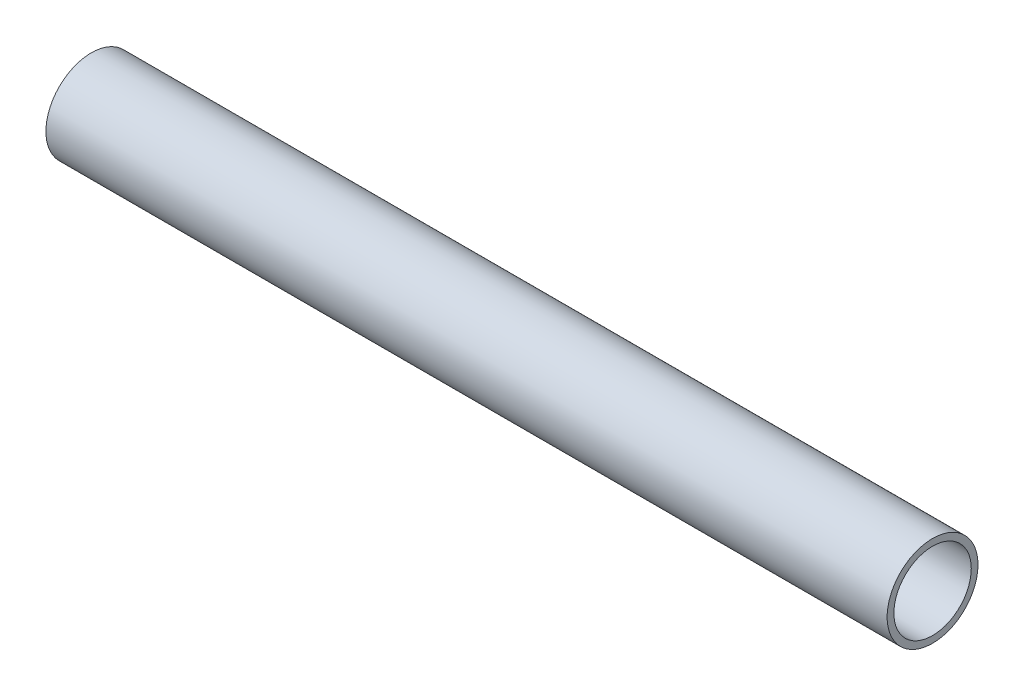
ISO-10303-21;
HEADER;
FILE_DESCRIPTION(('STEP AP214'),'2;1');
FILE_NAME('part.step','',(''),(''),'','','');
FILE_SCHEMA(('AUTOMOTIVE_DESIGN { 1 0 10303 214 1 1 1 1 }'));
ENDSEC;
DATA;
#1=APPLICATION_CONTEXT('core data for automotive mechanical design processes');
#2=APPLICATION_PROTOCOL_DEFINITION('international standard','automotive_design',2000,#1);
#3=PRODUCT_CONTEXT('',#1,'mechanical');
#4=PRODUCT('Part','Part','',(#3));
#5=PRODUCT_RELATED_PRODUCT_CATEGORY('part','',(#4));
#6=PRODUCT_DEFINITION_FORMATION('','',#4);
#7=PRODUCT_DEFINITION_CONTEXT('part definition',#1,'design');
#8=PRODUCT_DEFINITION('design','',#6,#7);
#9=PRODUCT_DEFINITION_SHAPE('','',#8);
#10=(LENGTH_UNIT() NAMED_UNIT(*) SI_UNIT(.MILLI.,.METRE.));
#11=(NAMED_UNIT(*) PLANE_ANGLE_UNIT() SI_UNIT($,.RADIAN.));
#12=(NAMED_UNIT(*) SI_UNIT($,.STERADIAN.) SOLID_ANGLE_UNIT());
#13=UNCERTAINTY_MEASURE_WITH_UNIT(LENGTH_MEASURE(1.E-05),#10,'distance_accuracy_value','');
#14=(GEOMETRIC_REPRESENTATION_CONTEXT(3) GLOBAL_UNCERTAINTY_ASSIGNED_CONTEXT((#13)) GLOBAL_UNIT_ASSIGNED_CONTEXT((#10,
#11,#12)) REPRESENTATION_CONTEXT('',''));
#15=CARTESIAN_POINT('',(0.,0.,0.));
#16=DIRECTION('',(0.,0.,1.));
#17=DIRECTION('',(1.,0.,0.));
#18=AXIS2_PLACEMENT_3D('',#15,#16,#17);
#19=CARTESIAN_POINT('',(200.,300.,-250.));
#20=DIRECTION('',(1.,0.,0.));
#21=DIRECTION('',(0.,0.,-1.));
#22=AXIS2_PLACEMENT_3D('',#19,#20,#21);
#23=CYLINDRICAL_SURFACE('',#22,13.5);
#24=CARTESIAN_POINT('',(200.,300.,-250.));
#25=DIRECTION('',(1.,0.,0.));
#26=DIRECTION('',(0.,0.,-1.));
#27=AXIS2_PLACEMENT_3D('',#24,#25,#26);
#28=CIRCLE('',#27,13.5);
#29=CARTESIAN_POINT('',(200.,300.,-263.5));
#30=VERTEX_POINT('',#29);
#31=EDGE_CURVE('E10',#30,#30,#28,.T.);
#32=CARTESIAN_POINT('',(450.,300.,-250.));
#33=DIRECTION('',(1.,0.,0.));
#34=DIRECTION('',(0.,0.,-1.));
#35=AXIS2_PLACEMENT_3D('',#32,#33,#34);
#36=CIRCLE('',#35,13.5);
#37=CARTESIAN_POINT('',(450.,300.,-263.5));
#38=VERTEX_POINT('',#37);
#39=EDGE_CURVE('E47',#38,#38,#36,.T.);
#40=CARTESIAN_POINT('',(200.,300.,-263.5));
#41=CARTESIAN_POINT('',(202.604166666667,300.,-263.5));
#42=CARTESIAN_POINT('',(205.208333333333,300.,-263.5));
#43=CARTESIAN_POINT('',(210.416666666667,300.,-263.5));
#44=CARTESIAN_POINT('',(213.020833333333,300.,-263.5));
#45=CARTESIAN_POINT('',(218.229166666667,300.,-263.5));
#46=CARTESIAN_POINT('',(220.833333333333,300.,-263.5));
#47=CARTESIAN_POINT('',(226.041666666667,300.,-263.5));
#48=CARTESIAN_POINT('',(228.645833333333,300.,-263.5));
#49=CARTESIAN_POINT('',(233.854166666667,300.,-263.5));
#50=CARTESIAN_POINT('',(236.458333333333,300.,-263.5));
#51=CARTESIAN_POINT('',(241.666666666667,300.,-263.5));
#52=CARTESIAN_POINT('',(244.270833333333,300.,-263.5));
#53=CARTESIAN_POINT('',(249.479166666667,300.,-263.5));
#54=CARTESIAN_POINT('',(252.083333333333,300.,-263.5));
#55=CARTESIAN_POINT('',(257.291666666667,300.,-263.5));
#56=CARTESIAN_POINT('',(259.895833333333,300.,-263.5));
#57=CARTESIAN_POINT('',(265.104166666667,300.,-263.5));
#58=CARTESIAN_POINT('',(267.708333333333,300.,-263.5));
#59=CARTESIAN_POINT('',(272.916666666667,300.,-263.5));
#60=CARTESIAN_POINT('',(275.520833333333,300.,-263.5));
#61=CARTESIAN_POINT('',(280.729166666667,300.,-263.5));
#62=CARTESIAN_POINT('',(283.333333333333,300.,-263.5));
#63=CARTESIAN_POINT('',(288.541666666667,300.,-263.5));
#64=CARTESIAN_POINT('',(291.145833333333,300.,-263.5));
#65=CARTESIAN_POINT('',(296.354166666667,300.,-263.5));
#66=CARTESIAN_POINT('',(298.958333333333,300.,-263.5));
#67=CARTESIAN_POINT('',(304.166666666667,300.,-263.5));
#68=CARTESIAN_POINT('',(306.770833333333,300.,-263.5));
#69=CARTESIAN_POINT('',(311.979166666667,300.,-263.5));
#70=CARTESIAN_POINT('',(314.583333333333,300.,-263.5));
#71=CARTESIAN_POINT('',(319.791666666667,300.,-263.5));
#72=CARTESIAN_POINT('',(322.395833333333,300.,-263.5));
#73=CARTESIAN_POINT('',(327.604166666667,300.,-263.5));
#74=CARTESIAN_POINT('',(330.208333333333,300.,-263.5));
#75=CARTESIAN_POINT('',(335.416666666667,300.,-263.5));
#76=CARTESIAN_POINT('',(338.020833333333,300.,-263.5));
#77=CARTESIAN_POINT('',(343.229166666667,300.,-263.5));
#78=CARTESIAN_POINT('',(345.833333333333,300.,-263.5));
#79=CARTESIAN_POINT('',(351.041666666667,300.,-263.5));
#80=CARTESIAN_POINT('',(353.645833333333,300.,-263.5));
#81=CARTESIAN_POINT('',(358.854166666667,300.,-263.5));
#82=CARTESIAN_POINT('',(361.458333333333,300.,-263.5));
#83=CARTESIAN_POINT('',(366.666666666667,300.,-263.5));
#84=CARTESIAN_POINT('',(369.270833333333,300.,-263.5));
#85=CARTESIAN_POINT('',(374.479166666667,300.,-263.5));
#86=CARTESIAN_POINT('',(377.083333333333,300.,-263.5));
#87=CARTESIAN_POINT('',(382.291666666667,300.,-263.5));
#88=CARTESIAN_POINT('',(384.895833333333,300.,-263.5));
#89=CARTESIAN_POINT('',(390.104166666667,300.,-263.5));
#90=CARTESIAN_POINT('',(392.708333333333,300.,-263.5));
#91=CARTESIAN_POINT('',(397.916666666667,300.,-263.5));
#92=CARTESIAN_POINT('',(400.520833333333,300.,-263.5));
#93=CARTESIAN_POINT('',(405.729166666667,300.,-263.5));
#94=CARTESIAN_POINT('',(408.333333333333,300.,-263.5));
#95=CARTESIAN_POINT('',(413.541666666667,300.,-263.5));
#96=CARTESIAN_POINT('',(416.145833333333,300.,-263.5));
#97=CARTESIAN_POINT('',(421.354166666667,300.,-263.5));
#98=CARTESIAN_POINT('',(423.958333333333,300.,-263.5));
#99=CARTESIAN_POINT('',(429.166666666667,300.,-263.5));
#100=CARTESIAN_POINT('',(431.770833333333,300.,-263.5));
#101=CARTESIAN_POINT('',(436.979166666667,300.,-263.5));
#102=CARTESIAN_POINT('',(439.583333333333,300.,-263.5));
#103=CARTESIAN_POINT('',(444.791666666667,300.,-263.5));
#104=CARTESIAN_POINT('',(447.395833333333,300.,-263.5));
#105=CARTESIAN_POINT('',(450.,300.,-263.5));
#106=B_SPLINE_CURVE_WITH_KNOTS('',3,(#40,#41,#42,#43,#44,#45,#46,#47,#48,#49,#50,#51,#52,#53,
#54,#55,#56,#57,#58,#59,#60,#61,#62,#63,#64,#65,#66,#67,#68,#69,#70,#71,#72,#73,#74,#75,#76,#77,
#78,#79,#80,#81,#82,#83,#84,#85,#86,#87,#88,#89,#90,#91,#92,#93,#94,#95,#96,#97,#98,#99,#100,
#101,#102,#103,#104,#105),.UNSPECIFIED.,.F.,.F.,(4,2,2,2,2,2,2,2,2,2,2,2,2,2,2,2,2,2,2,2,2,2,2,
2,2,2,2,2,2,2,2,2,4),(0.,7.81250000000003,15.625,23.4375,31.25,39.0625,46.875,54.6875,62.5,
70.3125,78.125,85.9375,93.75,101.5625,109.375,117.1875,125.,132.8125,140.625,148.4375,156.25,
164.0625,171.875,179.6875,187.5,195.3125,203.125,210.9375,218.75,226.5625,234.375,242.1875,
250.),.UNSPECIFIED.);
#107=EDGE_CURVE('BSEAM37',#30,#38,#106,.T.);
#108=ORIENTED_EDGE('',*,*,#31,.T.);
#109=ORIENTED_EDGE('',*,*,#39,.F.);
#110=ORIENTED_EDGE('',*,*,#107,.T.);
#111=ORIENTED_EDGE('',*,*,#107,.F.);
#112=EDGE_LOOP('',(#108,#110,#109,#111));
#113=FACE_BOUND('',#112,.T.);
#114=ADVANCED_FACE('F37',(#113),#23,.T.);
#115=CARTESIAN_POINT('',(200.,300.,-250.));
#116=DIRECTION('',(1.,0.,0.));
#117=DIRECTION('',(0.,0.,-1.));
#118=AXIS2_PLACEMENT_3D('',#115,#116,#117);
#119=PLANE('',#118);
#120=CARTESIAN_POINT('',(200.,300.,-250.));
#121=DIRECTION('',(1.,0.,0.));
#122=DIRECTION('',(0.,0.,-1.));
#123=AXIS2_PLACEMENT_3D('',#120,#121,#122);
#124=CIRCLE('',#123,11.5);
#125=CARTESIAN_POINT('',(200.,300.,-261.5));
#126=VERTEX_POINT('',#125);
#127=EDGE_CURVE('E43',#126,#126,#124,.T.);
#128=ORIENTED_EDGE('',*,*,#127,.T.);
#129=EDGE_LOOP('',(#128));
#130=FACE_BOUND('',#129,.T.);
#131=ORIENTED_EDGE('',*,*,#31,.F.);
#132=EDGE_LOOP('',(#131));
#133=FACE_BOUND('',#132,.T.);
#134=ADVANCED_FACE('F67',(#130,#133),#119,.F.);
#135=CARTESIAN_POINT('',(200.,300.,-250.));
#136=DIRECTION('',(1.,0.,0.));
#137=DIRECTION('',(0.,0.,-1.));
#138=AXIS2_PLACEMENT_3D('',#135,#136,#137);
#139=CYLINDRICAL_SURFACE('',#138,11.5);
#140=CARTESIAN_POINT('',(450.,300.,-250.));
#141=DIRECTION('',(1.,0.,0.));
#142=DIRECTION('',(0.,0.,-1.));
#143=AXIS2_PLACEMENT_3D('',#140,#141,#142);
#144=CIRCLE('',#143,11.5);
#145=CARTESIAN_POINT('',(450.,300.,-261.5));
#146=VERTEX_POINT('',#145);
#147=EDGE_CURVE('E51',#146,#146,#144,.T.);
#148=CARTESIAN_POINT('',(200.,300.,-261.5));
#149=CARTESIAN_POINT('',(202.604166666667,300.,-261.5));
#150=CARTESIAN_POINT('',(205.208333333333,300.,-261.5));
#151=CARTESIAN_POINT('',(210.416666666667,300.,-261.5));
#152=CARTESIAN_POINT('',(213.020833333333,300.,-261.5));
#153=CARTESIAN_POINT('',(218.229166666667,300.,-261.5));
#154=CARTESIAN_POINT('',(220.833333333333,300.,-261.5));
#155=CARTESIAN_POINT('',(226.041666666667,300.,-261.5));
#156=CARTESIAN_POINT('',(228.645833333333,300.,-261.5));
#157=CARTESIAN_POINT('',(233.854166666667,300.,-261.5));
#158=CARTESIAN_POINT('',(236.458333333333,300.,-261.5));
#159=CARTESIAN_POINT('',(241.666666666667,300.,-261.5));
#160=CARTESIAN_POINT('',(244.270833333333,300.,-261.5));
#161=CARTESIAN_POINT('',(249.479166666667,300.,-261.5));
#162=CARTESIAN_POINT('',(252.083333333333,300.,-261.5));
#163=CARTESIAN_POINT('',(257.291666666667,300.,-261.5));
#164=CARTESIAN_POINT('',(259.895833333333,300.,-261.5));
#165=CARTESIAN_POINT('',(265.104166666667,300.,-261.5));
#166=CARTESIAN_POINT('',(267.708333333333,300.,-261.5));
#167=CARTESIAN_POINT('',(272.916666666667,300.,-261.5));
#168=CARTESIAN_POINT('',(275.520833333333,300.,-261.5));
#169=CARTESIAN_POINT('',(280.729166666667,300.,-261.5));
#170=CARTESIAN_POINT('',(283.333333333333,300.,-261.5));
#171=CARTESIAN_POINT('',(288.541666666667,300.,-261.5));
#172=CARTESIAN_POINT('',(291.145833333333,300.,-261.5));
#173=CARTESIAN_POINT('',(296.354166666667,300.,-261.5));
#174=CARTESIAN_POINT('',(298.958333333333,300.,-261.5));
#175=CARTESIAN_POINT('',(304.166666666667,300.,-261.5));
#176=CARTESIAN_POINT('',(306.770833333333,300.,-261.5));
#177=CARTESIAN_POINT('',(311.979166666667,300.,-261.5));
#178=CARTESIAN_POINT('',(314.583333333333,300.,-261.5));
#179=CARTESIAN_POINT('',(319.791666666667,300.,-261.5));
#180=CARTESIAN_POINT('',(322.395833333333,300.,-261.5));
#181=CARTESIAN_POINT('',(327.604166666667,300.,-261.5));
#182=CARTESIAN_POINT('',(330.208333333333,300.,-261.5));
#183=CARTESIAN_POINT('',(335.416666666667,300.,-261.5));
#184=CARTESIAN_POINT('',(338.020833333333,300.,-261.5));
#185=CARTESIAN_POINT('',(343.229166666667,300.,-261.5));
#186=CARTESIAN_POINT('',(345.833333333333,300.,-261.5));
#187=CARTESIAN_POINT('',(351.041666666667,300.,-261.5));
#188=CARTESIAN_POINT('',(353.645833333333,300.,-261.5));
#189=CARTESIAN_POINT('',(358.854166666667,300.,-261.5));
#190=CARTESIAN_POINT('',(361.458333333333,300.,-261.5));
#191=CARTESIAN_POINT('',(366.666666666667,300.,-261.5));
#192=CARTESIAN_POINT('',(369.270833333333,300.,-261.5));
#193=CARTESIAN_POINT('',(374.479166666667,300.,-261.5));
#194=CARTESIAN_POINT('',(377.083333333333,300.,-261.5));
#195=CARTESIAN_POINT('',(382.291666666667,300.,-261.5));
#196=CARTESIAN_POINT('',(384.895833333333,300.,-261.5));
#197=CARTESIAN_POINT('',(390.104166666667,300.,-261.5));
#198=CARTESIAN_POINT('',(392.708333333333,300.,-261.5));
#199=CARTESIAN_POINT('',(397.916666666667,300.,-261.5));
#200=CARTESIAN_POINT('',(400.520833333333,300.,-261.5));
#201=CARTESIAN_POINT('',(405.729166666667,300.,-261.5));
#202=CARTESIAN_POINT('',(408.333333333333,300.,-261.5));
#203=CARTESIAN_POINT('',(413.541666666667,300.,-261.5));
#204=CARTESIAN_POINT('',(416.145833333333,300.,-261.5));
#205=CARTESIAN_POINT('',(421.354166666667,300.,-261.5));
#206=CARTESIAN_POINT('',(423.958333333333,300.,-261.5));
#207=CARTESIAN_POINT('',(429.166666666667,300.,-261.5));
#208=CARTESIAN_POINT('',(431.770833333333,300.,-261.5));
#209=CARTESIAN_POINT('',(436.979166666667,300.,-261.5));
#210=CARTESIAN_POINT('',(439.583333333333,300.,-261.5));
#211=CARTESIAN_POINT('',(444.791666666667,300.,-261.5));
#212=CARTESIAN_POINT('',(447.395833333333,300.,-261.5));
#213=CARTESIAN_POINT('',(450.,300.,-261.5));
#214=B_SPLINE_CURVE_WITH_KNOTS('',3,(#148,#149,#150,#151,#152,#153,#154,#155,#156,#157,#158,
#159,#160,#161,#162,#163,#164,#165,#166,#167,#168,#169,#170,#171,#172,#173,#174,#175,#176,#177,
#178,#179,#180,#181,#182,#183,#184,#185,#186,#187,#188,#189,#190,#191,#192,#193,#194,#195,#196,
#197,#198,#199,#200,#201,#202,#203,#204,#205,#206,#207,#208,#209,#210,#211,#212,#213),
.UNSPECIFIED.,.F.,.F.,(4,2,2,2,2,2,2,2,2,2,2,2,2,2,2,2,2,2,2,2,2,2,2,2,2,2,2,2,2,2,2,2,4),(0.,
7.81250000000003,15.625,23.4375,31.25,39.0625,46.875,54.6875,62.5,70.3125,78.125,85.9375,93.75,
101.5625,109.375,117.1875,125.,132.8125,140.625,148.4375,156.25,164.0625,171.875,179.6875,187.5,
195.3125,203.125,210.9375,218.75,226.5625,234.375,242.1875,250.),.UNSPECIFIED.);
#215=EDGE_CURVE('BSEAM57',#126,#146,#214,.T.);
#216=ORIENTED_EDGE('',*,*,#127,.F.);
#217=ORIENTED_EDGE('',*,*,#147,.T.);
#218=ORIENTED_EDGE('',*,*,#215,.T.);
#219=ORIENTED_EDGE('',*,*,#215,.F.);
#220=EDGE_LOOP('',(#216,#218,#217,#219));
#221=FACE_BOUND('',#220,.T.);
#222=ADVANCED_FACE('F57',(#221),#139,.F.);
#223=CARTESIAN_POINT('',(450.,300.,-250.));
#224=DIRECTION('',(1.,0.,0.));
#225=DIRECTION('',(0.,0.,-1.));
#226=AXIS2_PLACEMENT_3D('',#223,#224,#225);
#227=PLANE('',#226);
#228=ORIENTED_EDGE('',*,*,#39,.T.);
#229=EDGE_LOOP('',(#228));
#230=FACE_BOUND('',#229,.T.);
#231=ORIENTED_EDGE('',*,*,#147,.F.);
#232=EDGE_LOOP('',(#231));
#233=FACE_BOUND('',#232,.T.);
#234=ADVANCED_FACE('F59',(#230,#233),#227,.T.);
#235=CLOSED_SHELL('',(#114,#134,#222,#234));
#236=MANIFOLD_SOLID_BREP('B2',#235);
#237=ADVANCED_BREP_SHAPE_REPRESENTATION('',(#18,#236),#14);
#238=SHAPE_DEFINITION_REPRESENTATION(#9,#237);
ENDSEC;
END-ISO-10303-21;
